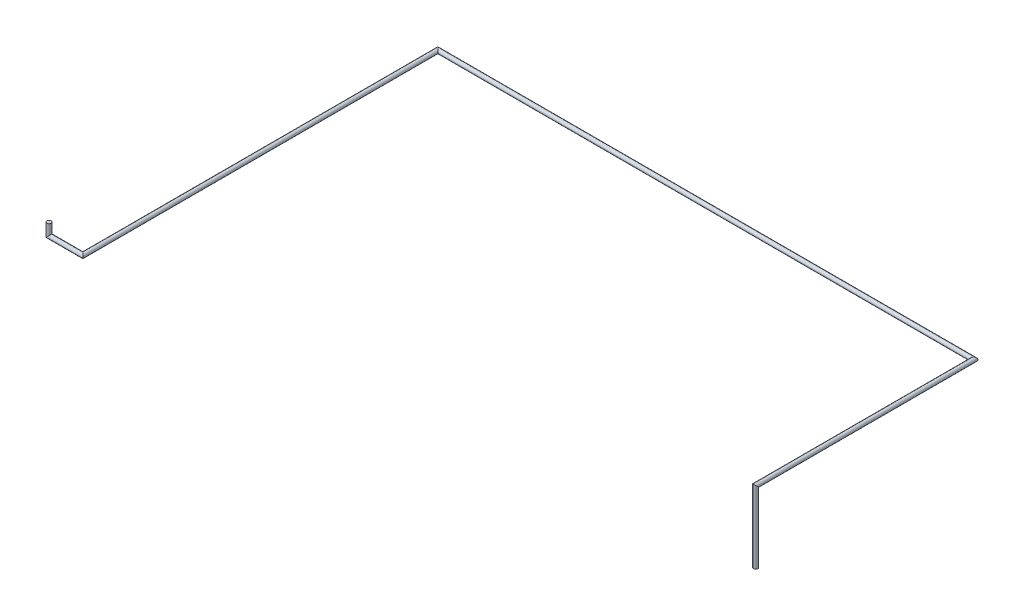
ISO-10303-21;
HEADER;
FILE_DESCRIPTION(('STEP AP214'),'2;1');
FILE_NAME('part.step','',(''),(''),'','','');
FILE_SCHEMA(('AUTOMOTIVE_DESIGN { 1 0 10303 214 1 1 1 1 }'));
ENDSEC;
DATA;
#1=APPLICATION_CONTEXT('core data for automotive mechanical design processes');
#2=APPLICATION_PROTOCOL_DEFINITION('international standard','automotive_design',2000,#1);
#3=PRODUCT_CONTEXT('',#1,'mechanical');
#4=PRODUCT('Part','Part','',(#3));
#5=PRODUCT_RELATED_PRODUCT_CATEGORY('part','',(#4));
#6=PRODUCT_DEFINITION_FORMATION('','',#4);
#7=PRODUCT_DEFINITION_CONTEXT('part definition',#1,'design');
#8=PRODUCT_DEFINITION('design','',#6,#7);
#9=PRODUCT_DEFINITION_SHAPE('','',#8);
#10=(LENGTH_UNIT() NAMED_UNIT(*) SI_UNIT(.MILLI.,.METRE.));
#11=(NAMED_UNIT(*) PLANE_ANGLE_UNIT() SI_UNIT($,.RADIAN.));
#12=(NAMED_UNIT(*) SI_UNIT($,.STERADIAN.) SOLID_ANGLE_UNIT());
#13=UNCERTAINTY_MEASURE_WITH_UNIT(LENGTH_MEASURE(1.E-05),#10,'distance_accuracy_value','');
#14=(GEOMETRIC_REPRESENTATION_CONTEXT(3) GLOBAL_UNCERTAINTY_ASSIGNED_CONTEXT((#13)) GLOBAL_UNIT_ASSIGNED_CONTEXT((#10,
#11,#12)) REPRESENTATION_CONTEXT('',''));
#15=CARTESIAN_POINT('',(0.,0.,0.));
#16=DIRECTION('',(0.,0.,1.));
#17=DIRECTION('',(1.,0.,0.));
#18=AXIS2_PLACEMENT_3D('',#15,#16,#17);
#19=CARTESIAN_POINT('',(0.,20.,0.));
#20=DIRECTION('',(0.,-1.,0.));
#21=DIRECTION('',(0.,0.,-1.));
#22=AXIS2_PLACEMENT_3D('',#19,#20,#21);
#23=CYLINDRICAL_SURFACE('',#22,12.7);
#24=CARTESIAN_POINT('',(0.,20.,0.));
#25=DIRECTION('',(0.,1.,0.));
#26=DIRECTION('',(0.,0.,1.));
#27=AXIS2_PLACEMENT_3D('',#24,#25,#26);
#28=CIRCLE('',#27,12.7);
#29=CARTESIAN_POINT('',(-0.6,20.,12.6858188541379));
#30=VERTEX_POINT('',#29);
#31=CARTESIAN_POINT('',(0.6,20.,12.6858188541379));
#32=VERTEX_POINT('',#31);
#33=EDGE_CURVE('E11',#30,#32,#28,.T.);
#34=ORIENTED_EDGE('',*,*,#33,.T.);
#35=DIRECTION('',(0.,-1.,0.));
#36=VECTOR('',#35,1.);
#37=CARTESIAN_POINT('',(0.6,20.,12.6858188541379));
#38=LINE('',#37,#36);
#39=CARTESIAN_POINT('',(0.6,0.,12.6858188541379));
#40=VERTEX_POINT('',#39);
#41=EDGE_CURVE('E96',#32,#40,#38,.T.);
#42=ORIENTED_EDGE('',*,*,#41,.T.);
#43=CARTESIAN_POINT('',(0.,0.,0.));
#44=DIRECTION('',(0.,1.,0.));
#45=DIRECTION('',(0.,0.,1.));
#46=AXIS2_PLACEMENT_3D('',#43,#44,#45);
#47=CIRCLE('',#46,12.7);
#48=CARTESIAN_POINT('',(-0.6,0.,12.6858188541379));
#49=VERTEX_POINT('',#48);
#50=EDGE_CURVE('E42',#40,#49,#47,.T.);
#51=ORIENTED_EDGE('',*,*,#50,.T.);
#52=DIRECTION('',(0.,-1.,0.));
#53=VECTOR('',#52,1.);
#54=CARTESIAN_POINT('',(-0.6,20.,12.6858188541379));
#55=LINE('',#54,#53);
#56=EDGE_CURVE('E52',#49,#30,#55,.F.);
#57=ORIENTED_EDGE('',*,*,#56,.T.);
#58=EDGE_LOOP('',(#34,#42,#51,#57));
#59=FACE_BOUND('',#58,.T.);
#60=CARTESIAN_POINT('',(0.,420.,0.));
#61=DIRECTION('',(0.,0.707106781186548,-0.707106781186548));
#62=DIRECTION('',(0.,0.707106781186548,0.707106781186548));
#63=AXIS2_PLACEMENT_3D('',#60,#61,#62);
#64=ELLIPSE('',#63,17.9605122421383,12.7);
#65=CARTESIAN_POINT('',(0.,432.7,12.7));
#66=VERTEX_POINT('',#65);
#67=EDGE_CURVE('E125',#66,#66,#64,.F.);
#68=ORIENTED_EDGE('',*,*,#67,.T.);
#69=EDGE_LOOP('',(#68));
#70=FACE_BOUND('',#69,.T.);
#71=ADVANCED_FACE('F35',(#59,#70),#23,.T.);
#72=CARTESIAN_POINT('',(0.,0.,0.));
#73=DIRECTION('',(0.,1.,0.));
#74=DIRECTION('',(0.,0.,1.));
#75=AXIS2_PLACEMENT_3D('',#72,#73,#74);
#76=PLANE('',#75);
#77=ORIENTED_EDGE('',*,*,#50,.F.);
#78=DIRECTION('',(0.,0.,1.));
#79=VECTOR('',#78,1.);
#80=CARTESIAN_POINT('',(0.6,0.,12.1));
#81=LINE('',#80,#79);
#82=CARTESIAN_POINT('',(0.6,0.,13.3));
#83=VERTEX_POINT('',#82);
#84=EDGE_CURVE('E116',#40,#83,#81,.T.);
#85=ORIENTED_EDGE('',*,*,#84,.T.);
#86=DIRECTION('',(-1.,0.,0.));
#87=VECTOR('',#86,1.);
#88=CARTESIAN_POINT('',(-0.6,0.,13.3));
#89=LINE('',#88,#87);
#90=CARTESIAN_POINT('',(-0.6,0.,13.3));
#91=VERTEX_POINT('',#90);
#92=EDGE_CURVE('E106',#83,#91,#89,.T.);
#93=ORIENTED_EDGE('',*,*,#92,.T.);
#94=DIRECTION('',(0.,0.,-1.));
#95=VECTOR('',#94,1.);
#96=CARTESIAN_POINT('',(-0.6,0.,12.1));
#97=LINE('',#96,#95);
#98=EDGE_CURVE('E100',#91,#49,#97,.T.);
#99=ORIENTED_EDGE('',*,*,#98,.T.);
#100=EDGE_LOOP('',(#77,#85,#93,#99));
#101=FACE_BOUND('',#100,.T.);
#102=ADVANCED_FACE('F145',(#101),#76,.F.);
#103=CARTESIAN_POINT('',(-3370.,489.999999999999,810.));
#104=DIRECTION('',(0.,1.,0.));
#105=DIRECTION('',(1.,0.,0.));
#106=AXIS2_PLACEMENT_3D('',#103,#104,#105);
#107=PLANE('',#106);
#108=CARTESIAN_POINT('',(-3370.,489.999999999999,810.));
#109=DIRECTION('',(0.,1.,0.));
#110=DIRECTION('',(1.,0.,0.));
#111=AXIS2_PLACEMENT_3D('',#108,#109,#110);
#112=CIRCLE('',#111,12.7);
#113=CARTESIAN_POINT('',(-3357.3,489.999999999999,810.));
#114=VERTEX_POINT('',#113);
#115=EDGE_CURVE('E124',#114,#114,#112,.T.);
#116=ORIENTED_EDGE('',*,*,#115,.T.);
#117=EDGE_LOOP('',(#116));
#118=FACE_BOUND('',#117,.T.);
#119=ADVANCED_FACE('F147',(#118),#107,.T.);
#120=CARTESIAN_POINT('',(-3370.,405.930000000001,810.));
#121=DIRECTION('',(0.,1.,0.));
#122=DIRECTION('',(0.,0.,1.));
#123=AXIS2_PLACEMENT_3D('',#120,#121,#122);
#124=CYLINDRICAL_SURFACE('',#123,12.7);
#125=CARTESIAN_POINT('',(-3370.,420.,810.));
#126=DIRECTION('',(-0.707106781186547,0.707106781186547,0.));
#127=DIRECTION('',(-0.707106781186548,-0.707106781186548,0.));
#128=AXIS2_PLACEMENT_3D('',#125,#126,#127);
#129=ELLIPSE('',#128,17.9605122421383,12.7);
#130=CARTESIAN_POINT('',(-3382.7,407.3,810.));
#131=VERTEX_POINT('',#130);
#132=EDGE_CURVE('E137',#131,#131,#129,.F.);
#133=ORIENTED_EDGE('',*,*,#132,.F.);
#134=EDGE_LOOP('',(#133));
#135=FACE_BOUND('',#134,.T.);
#136=ORIENTED_EDGE('',*,*,#115,.F.);
#137=EDGE_LOOP('',(#136));
#138=FACE_BOUND('',#137,.T.);
#139=ADVANCED_FACE('F153',(#135,#138),#124,.T.);
#140=CARTESIAN_POINT('',(-3141.96,420.,810.));
#141=DIRECTION('',(-1.,0.,0.));
#142=DIRECTION('',(0.,0.,1.));
#143=AXIS2_PLACEMENT_3D('',#140,#141,#142);
#144=CYLINDRICAL_SURFACE('',#143,12.7);
#145=CARTESIAN_POINT('',(-3170.,420.,810.000000000001));
#146=DIRECTION('',(-0.707106781186547,0.,0.707106781186547));
#147=DIRECTION('',(0.707106781186548,0.,0.707106781186548));
#148=AXIS2_PLACEMENT_3D('',#145,#146,#147);
#149=ELLIPSE('',#148,17.9605122421383,12.7);
#150=CARTESIAN_POINT('',(-3157.3,420.,822.700000000001));
#151=VERTEX_POINT('',#150);
#152=EDGE_CURVE('E134',#151,#151,#149,.F.);
#153=ORIENTED_EDGE('',*,*,#152,.F.);
#154=EDGE_LOOP('',(#153));
#155=FACE_BOUND('',#154,.T.);
#156=ORIENTED_EDGE('',*,*,#132,.T.);
#157=EDGE_LOOP('',(#156));
#158=FACE_BOUND('',#157,.T.);
#159=ADVANCED_FACE('F173',(#155,#158),#144,.T.);
#160=CARTESIAN_POINT('',(-3170.,420.,-1318.04));
#161=DIRECTION('',(0.,0.,1.));
#162=DIRECTION('',(1.,0.,0.));
#163=AXIS2_PLACEMENT_3D('',#160,#161,#162);
#164=CYLINDRICAL_SURFACE('',#163,12.7);
#165=CARTESIAN_POINT('',(-3170.,420.,-1290.));
#166=DIRECTION('',(-0.707106781186547,0.,0.707106781186547));
#167=DIRECTION('',(-0.707106781186548,0.,-0.707106781186548));
#168=AXIS2_PLACEMENT_3D('',#165,#166,#167);
#169=ELLIPSE('',#168,17.9605122421383,12.7);
#170=CARTESIAN_POINT('',(-3182.7,420.,-1302.7));
#171=VERTEX_POINT('',#170);
#172=EDGE_CURVE('E131',#171,#171,#169,.F.);
#173=ORIENTED_EDGE('',*,*,#172,.F.);
#174=EDGE_LOOP('',(#173));
#175=FACE_BOUND('',#174,.T.);
#176=ORIENTED_EDGE('',*,*,#152,.T.);
#177=EDGE_LOOP('',(#176));
#178=FACE_BOUND('',#177,.T.);
#179=ADVANCED_FACE('F165',(#175,#178),#164,.T.);
#180=CARTESIAN_POINT('',(28.0399999999998,420.,-1290.));
#181=DIRECTION('',(-1.,0.,0.));
#182=DIRECTION('',(0.,0.,1.));
#183=AXIS2_PLACEMENT_3D('',#180,#181,#182);
#184=CYLINDRICAL_SURFACE('',#183,12.7);
#185=CARTESIAN_POINT('',(0.,420.,-1290.));
#186=DIRECTION('',(-0.707106781186548,0.,-0.707106781186548));
#187=DIRECTION('',(0.707106781186548,0.,-0.707106781186548));
#188=AXIS2_PLACEMENT_3D('',#185,#186,#187);
#189=ELLIPSE('',#188,17.9605122421383,12.7);
#190=CARTESIAN_POINT('',(12.7,420.,-1302.7));
#191=VERTEX_POINT('',#190);
#192=EDGE_CURVE('E128',#191,#191,#189,.F.);
#193=ORIENTED_EDGE('',*,*,#192,.F.);
#194=EDGE_LOOP('',(#193));
#195=FACE_BOUND('',#194,.T.);
#196=ORIENTED_EDGE('',*,*,#172,.T.);
#197=EDGE_LOOP('',(#196));
#198=FACE_BOUND('',#197,.T.);
#199=ADVANCED_FACE('F157',(#195,#198),#184,.T.);
#200=CARTESIAN_POINT('',(0.,420.,14.0699999999999));
#201=DIRECTION('',(0.,0.,-1.));
#202=DIRECTION('',(-1.,0.,0.));
#203=AXIS2_PLACEMENT_3D('',#200,#201,#202);
#204=CYLINDRICAL_SURFACE('',#203,12.7);
#205=ORIENTED_EDGE('',*,*,#67,.F.);
#206=EDGE_LOOP('',(#205));
#207=FACE_BOUND('',#206,.T.);
#208=ORIENTED_EDGE('',*,*,#192,.T.);
#209=EDGE_LOOP('',(#208));
#210=FACE_BOUND('',#209,.T.);
#211=ADVANCED_FACE('F148',(#207,#210),#204,.T.);
#212=CARTESIAN_POINT('',(0.6,20.,12.1));
#213=DIRECTION('',(1.,0.,0.));
#214=DIRECTION('',(0.,0.,-1.));
#215=AXIS2_PLACEMENT_3D('',#212,#213,#214);
#216=PLANE('',#215);
#217=ORIENTED_EDGE('',*,*,#41,.F.);
#218=DIRECTION('',(0.,0.,1.));
#219=VECTOR('',#218,1.);
#220=CARTESIAN_POINT('',(0.6,20.,12.1));
#221=LINE('',#220,#219);
#222=CARTESIAN_POINT('',(0.6,20.,13.3));
#223=VERTEX_POINT('',#222);
#224=EDGE_CURVE('E90',#32,#223,#221,.T.);
#225=ORIENTED_EDGE('',*,*,#224,.T.);
#226=DIRECTION('',(0.,-1.,0.));
#227=VECTOR('',#226,1.);
#228=CARTESIAN_POINT('',(0.6,20.,13.3));
#229=LINE('',#228,#227);
#230=EDGE_CURVE('E94',#223,#83,#229,.T.);
#231=ORIENTED_EDGE('',*,*,#230,.T.);
#232=ORIENTED_EDGE('',*,*,#84,.F.);
#233=EDGE_LOOP('',(#217,#225,#231,#232));
#234=FACE_BOUND('',#233,.T.);
#235=ADVANCED_FACE('F92',(#234),#216,.T.);
#236=CARTESIAN_POINT('',(-0.6,20.,12.1));
#237=DIRECTION('',(-1.,0.,0.));
#238=DIRECTION('',(0.,0.,1.));
#239=AXIS2_PLACEMENT_3D('',#236,#237,#238);
#240=PLANE('',#239);
#241=ORIENTED_EDGE('',*,*,#56,.F.);
#242=ORIENTED_EDGE('',*,*,#98,.F.);
#243=DIRECTION('',(0.,-1.,0.));
#244=VECTOR('',#243,1.);
#245=CARTESIAN_POINT('',(-0.6,20.,13.3));
#246=LINE('',#245,#244);
#247=CARTESIAN_POINT('',(-0.6,20.,13.3));
#248=VERTEX_POINT('',#247);
#249=EDGE_CURVE('E107',#248,#91,#246,.T.);
#250=ORIENTED_EDGE('',*,*,#249,.F.);
#251=DIRECTION('',(0.,0.,-1.));
#252=VECTOR('',#251,1.);
#253=CARTESIAN_POINT('',(-0.6,20.,12.1));
#254=LINE('',#253,#252);
#255=EDGE_CURVE('E108',#248,#30,#254,.T.);
#256=ORIENTED_EDGE('',*,*,#255,.T.);
#257=EDGE_LOOP('',(#241,#242,#250,#256));
#258=FACE_BOUND('',#257,.T.);
#259=ADVANCED_FACE('F144',(#258),#240,.T.);
#260=CARTESIAN_POINT('',(-0.6,20.,13.3));
#261=DIRECTION('',(0.,0.,1.));
#262=DIRECTION('',(1.,0.,0.));
#263=AXIS2_PLACEMENT_3D('',#260,#261,#262);
#264=PLANE('',#263);
#265=ORIENTED_EDGE('',*,*,#92,.F.);
#266=ORIENTED_EDGE('',*,*,#230,.F.);
#267=DIRECTION('',(-1.,0.,0.));
#268=VECTOR('',#267,1.);
#269=CARTESIAN_POINT('',(-0.6,20.,13.3));
#270=LINE('',#269,#268);
#271=EDGE_CURVE('E99',#223,#248,#270,.T.);
#272=ORIENTED_EDGE('',*,*,#271,.T.);
#273=ORIENTED_EDGE('',*,*,#249,.T.);
#274=EDGE_LOOP('',(#265,#266,#272,#273));
#275=FACE_BOUND('',#274,.T.);
#276=ADVANCED_FACE('F104',(#275),#264,.T.);
#277=CARTESIAN_POINT('',(0.,20.,0.));
#278=DIRECTION('',(0.,1.,0.));
#279=DIRECTION('',(0.,0.,1.));
#280=AXIS2_PLACEMENT_3D('',#277,#278,#279);
#281=PLANE('',#280);
#282=ORIENTED_EDGE('',*,*,#33,.F.);
#283=ORIENTED_EDGE('',*,*,#255,.F.);
#284=ORIENTED_EDGE('',*,*,#271,.F.);
#285=ORIENTED_EDGE('',*,*,#224,.F.);
#286=EDGE_LOOP('',(#282,#283,#284,#285));
#287=FACE_BOUND('',#286,.T.);
#288=ADVANCED_FACE('F111',(#287),#281,.T.);
#289=CLOSED_SHELL('',(#71,#102,#119,#139,#159,#179,#199,#211,#235,#259,#276,#288));
#290=MANIFOLD_SOLID_BREP('B2',#289);
#291=ADVANCED_BREP_SHAPE_REPRESENTATION('',(#18,#290),#14);
#292=SHAPE_DEFINITION_REPRESENTATION(#9,#291);
ENDSEC;
END-ISO-10303-21;
